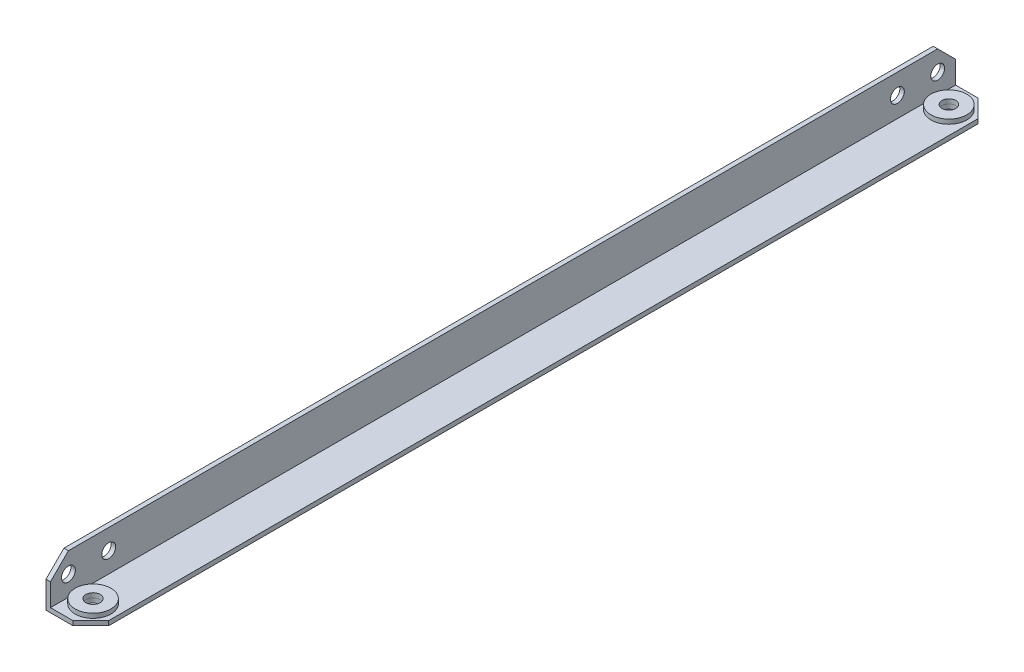
ISO-10303-21;
HEADER;
FILE_DESCRIPTION(('STEP AP214'),'2;1');
FILE_NAME('part.step','',(''),(''),'','','');
FILE_SCHEMA(('AUTOMOTIVE_DESIGN { 1 0 10303 214 1 1 1 1 }'));
ENDSEC;
DATA;
#1=APPLICATION_CONTEXT('core data for automotive mechanical design processes');
#2=APPLICATION_PROTOCOL_DEFINITION('international standard','automotive_design',2000,#1);
#3=PRODUCT_CONTEXT('',#1,'mechanical');
#4=PRODUCT('Part','Part','',(#3));
#5=PRODUCT_RELATED_PRODUCT_CATEGORY('part','',(#4));
#6=PRODUCT_DEFINITION_FORMATION('','',#4);
#7=PRODUCT_DEFINITION_CONTEXT('part definition',#1,'design');
#8=PRODUCT_DEFINITION('design','',#6,#7);
#9=PRODUCT_DEFINITION_SHAPE('','',#8);
#10=(LENGTH_UNIT() NAMED_UNIT(*) SI_UNIT(.MILLI.,.METRE.));
#11=(NAMED_UNIT(*) PLANE_ANGLE_UNIT() SI_UNIT($,.RADIAN.));
#12=(NAMED_UNIT(*) SI_UNIT($,.STERADIAN.) SOLID_ANGLE_UNIT());
#13=UNCERTAINTY_MEASURE_WITH_UNIT(LENGTH_MEASURE(1.E-05),#10,'distance_accuracy_value','');
#14=(GEOMETRIC_REPRESENTATION_CONTEXT(3) GLOBAL_UNCERTAINTY_ASSIGNED_CONTEXT((#13)) GLOBAL_UNIT_ASSIGNED_CONTEXT((#10,
#11,#12)) REPRESENTATION_CONTEXT('',''));
#15=CARTESIAN_POINT('',(0.,0.,0.));
#16=DIRECTION('',(0.,0.,1.));
#17=DIRECTION('',(1.,0.,0.));
#18=AXIS2_PLACEMENT_3D('',#15,#16,#17);
#19=CARTESIAN_POINT('',(50.,20.,55.));
#20=DIRECTION('',(0.,-1.,0.));
#21=DIRECTION('',(1.,0.,0.));
#22=AXIS2_PLACEMENT_3D('',#19,#20,#21);
#23=CYLINDRICAL_SURFACE('',#22,40.);
#24=CARTESIAN_POINT('',(50.,20.,55.));
#25=DIRECTION('',(0.,1.,0.));
#26=DIRECTION('',(-1.,0.,0.));
#27=AXIS2_PLACEMENT_3D('',#24,#25,#26);
#28=CIRCLE('',#27,40.);
#29=CARTESIAN_POINT('',(10.,20.,55.));
#30=VERTEX_POINT('',#29);
#31=EDGE_CURVE('E11',#30,#30,#28,.T.);
#32=ORIENTED_EDGE('',*,*,#31,.F.);
#33=EDGE_LOOP('',(#32));
#34=FACE_BOUND('',#33,.T.);
#35=CARTESIAN_POINT('',(50.,9.99999999999999,55.));
#36=DIRECTION('',(0.,1.,0.));
#37=DIRECTION('',(-1.,0.,0.));
#38=AXIS2_PLACEMENT_3D('',#35,#36,#37);
#39=CIRCLE('',#38,40.);
#40=CARTESIAN_POINT('',(10.,9.99999999999999,55.));
#41=VERTEX_POINT('',#40);
#42=EDGE_CURVE('E46',#41,#41,#39,.T.);
#43=ORIENTED_EDGE('',*,*,#42,.T.);
#44=EDGE_LOOP('',(#43));
#45=FACE_BOUND('',#44,.T.);
#46=ADVANCED_FACE('F39',(#34,#45),#23,.T.);
#47=CARTESIAN_POINT('',(50.,20.,55.));
#48=DIRECTION('',(0.,1.,0.));
#49=DIRECTION('',(-1.,0.,0.));
#50=AXIS2_PLACEMENT_3D('',#47,#48,#49);
#51=PLANE('',#50);
#52=CARTESIAN_POINT('',(50.,20.,55.));
#53=DIRECTION('',(0.,1.,0.));
#54=DIRECTION('',(-1.,0.,0.));
#55=AXIS2_PLACEMENT_3D('',#52,#53,#54);
#56=CIRCLE('',#55,15.5);
#57=CARTESIAN_POINT('',(34.5,20.,55.));
#58=VERTEX_POINT('',#57);
#59=EDGE_CURVE('E52',#58,#58,#56,.T.);
#60=ORIENTED_EDGE('',*,*,#59,.F.);
#61=EDGE_LOOP('',(#60));
#62=FACE_BOUND('',#61,.T.);
#63=ORIENTED_EDGE('',*,*,#31,.T.);
#64=EDGE_LOOP('',(#63));
#65=FACE_BOUND('',#64,.T.);
#66=ADVANCED_FACE('F68',(#62,#65),#51,.T.);
#67=CARTESIAN_POINT('',(50.,9.99999999999999,55.));
#68=DIRECTION('',(0.,1.,0.));
#69=DIRECTION('',(-1.,0.,0.));
#70=AXIS2_PLACEMENT_3D('',#67,#68,#69);
#71=PLANE('',#70);
#72=CARTESIAN_POINT('',(50.,9.99999999999999,55.));
#73=DIRECTION('',(0.,1.,0.));
#74=DIRECTION('',(-1.,0.,0.));
#75=AXIS2_PLACEMENT_3D('',#72,#73,#74);
#76=CIRCLE('',#75,15.5);
#77=CARTESIAN_POINT('',(34.5,9.99999999999999,55.));
#78=VERTEX_POINT('',#77);
#79=EDGE_CURVE('E42',#78,#78,#76,.T.);
#80=ORIENTED_EDGE('',*,*,#79,.T.);
#81=EDGE_LOOP('',(#80));
#82=FACE_BOUND('',#81,.T.);
#83=ORIENTED_EDGE('',*,*,#42,.F.);
#84=EDGE_LOOP('',(#83));
#85=FACE_BOUND('',#84,.T.);
#86=ADVANCED_FACE('F59',(#82,#85),#71,.F.);
#87=CARTESIAN_POINT('',(50.,0.,55.));
#88=DIRECTION('',(0.,1.,0.));
#89=DIRECTION('',(-1.,0.,0.));
#90=AXIS2_PLACEMENT_3D('',#87,#88,#89);
#91=CYLINDRICAL_SURFACE('',#90,15.5);
#92=ORIENTED_EDGE('',*,*,#59,.T.);
#93=EDGE_LOOP('',(#92));
#94=FACE_BOUND('',#93,.T.);
#95=ORIENTED_EDGE('',*,*,#79,.F.);
#96=EDGE_LOOP('',(#95));
#97=FACE_BOUND('',#96,.T.);
#98=ADVANCED_FACE('F62',(#94,#97),#91,.F.);
#99=CLOSED_SHELL('',(#46,#66,#86,#98));
#100=MANIFOLD_SOLID_BREP('B2',#99);
#101=CARTESIAN_POINT('',(50.,20.,1965.));
#102=DIRECTION('',(0.,-1.,0.));
#103=DIRECTION('',(1.,0.,0.));
#104=AXIS2_PLACEMENT_3D('',#101,#102,#103);
#105=CYLINDRICAL_SURFACE('',#104,40.);
#106=CARTESIAN_POINT('',(50.,20.,1965.));
#107=DIRECTION('',(0.,1.,0.));
#108=DIRECTION('',(-1.,0.,0.));
#109=AXIS2_PLACEMENT_3D('',#106,#107,#108);
#110=CIRCLE('',#109,40.);
#111=CARTESIAN_POINT('',(9.99999999999999,20.,1965.));
#112=VERTEX_POINT('',#111);
#113=EDGE_CURVE('E38',#112,#112,#110,.T.);
#114=ORIENTED_EDGE('',*,*,#113,.F.);
#115=EDGE_LOOP('',(#114));
#116=FACE_BOUND('',#115,.T.);
#117=CARTESIAN_POINT('',(50.,9.99999999999999,1965.));
#118=DIRECTION('',(0.,1.,0.));
#119=DIRECTION('',(-1.,0.,0.));
#120=AXIS2_PLACEMENT_3D('',#117,#118,#119);
#121=CIRCLE('',#120,40.);
#122=CARTESIAN_POINT('',(9.99999999999999,9.99999999999999,1965.));
#123=VERTEX_POINT('',#122);
#124=EDGE_CURVE('E116',#123,#123,#121,.T.);
#125=ORIENTED_EDGE('',*,*,#124,.T.);
#126=EDGE_LOOP('',(#125));
#127=FACE_BOUND('',#126,.T.);
#128=ADVANCED_FACE('F109',(#116,#127),#105,.T.);
#129=CARTESIAN_POINT('',(50.,20.,1965.));
#130=DIRECTION('',(0.,1.,0.));
#131=DIRECTION('',(-1.,0.,0.));
#132=AXIS2_PLACEMENT_3D('',#129,#130,#131);
#133=PLANE('',#132);
#134=CARTESIAN_POINT('',(50.,20.,1965.));
#135=DIRECTION('',(0.,1.,0.));
#136=DIRECTION('',(-1.,0.,0.));
#137=AXIS2_PLACEMENT_3D('',#134,#135,#136);
#138=CIRCLE('',#137,16.);
#139=CARTESIAN_POINT('',(34.,20.,1965.));
#140=VERTEX_POINT('',#139);
#141=EDGE_CURVE('E122',#140,#140,#138,.T.);
#142=ORIENTED_EDGE('',*,*,#141,.F.);
#143=EDGE_LOOP('',(#142));
#144=FACE_BOUND('',#143,.T.);
#145=ORIENTED_EDGE('',*,*,#113,.T.);
#146=EDGE_LOOP('',(#145));
#147=FACE_BOUND('',#146,.T.);
#148=ADVANCED_FACE('F138',(#144,#147),#133,.T.);
#149=CARTESIAN_POINT('',(50.,9.99999999999999,1965.));
#150=DIRECTION('',(0.,1.,0.));
#151=DIRECTION('',(-1.,0.,0.));
#152=AXIS2_PLACEMENT_3D('',#149,#150,#151);
#153=PLANE('',#152);
#154=CARTESIAN_POINT('',(50.,9.99999999999999,1965.));
#155=DIRECTION('',(0.,1.,0.));
#156=DIRECTION('',(-1.,0.,0.));
#157=AXIS2_PLACEMENT_3D('',#154,#155,#156);
#158=CIRCLE('',#157,16.);
#159=CARTESIAN_POINT('',(34.,9.99999999999999,1965.));
#160=VERTEX_POINT('',#159);
#161=EDGE_CURVE('E112',#160,#160,#158,.T.);
#162=ORIENTED_EDGE('',*,*,#161,.T.);
#163=EDGE_LOOP('',(#162));
#164=FACE_BOUND('',#163,.T.);
#165=ORIENTED_EDGE('',*,*,#124,.F.);
#166=EDGE_LOOP('',(#165));
#167=FACE_BOUND('',#166,.T.);
#168=ADVANCED_FACE('F129',(#164,#167),#153,.F.);
#169=CARTESIAN_POINT('',(50.,0.,1965.));
#170=DIRECTION('',(0.,1.,0.));
#171=DIRECTION('',(-1.,0.,0.));
#172=AXIS2_PLACEMENT_3D('',#169,#170,#171);
#173=CYLINDRICAL_SURFACE('',#172,16.);
#174=ORIENTED_EDGE('',*,*,#141,.T.);
#175=EDGE_LOOP('',(#174));
#176=FACE_BOUND('',#175,.T.);
#177=ORIENTED_EDGE('',*,*,#161,.F.);
#178=EDGE_LOOP('',(#177));
#179=FACE_BOUND('',#178,.T.);
#180=ADVANCED_FACE('F132',(#176,#179),#173,.F.);
#181=CLOSED_SHELL('',(#128,#148,#168,#180));
#182=MANIFOLD_SOLID_BREP('B6',#181);
#183=CARTESIAN_POINT('',(0.,0.,2020.));
#184=DIRECTION('',(1.,0.,0.));
#185=DIRECTION('',(0.,0.,-1.));
#186=AXIS2_PLACEMENT_3D('',#183,#184,#185);
#187=PLANE('',#186);
#188=CARTESIAN_POINT('',(0.,55.,40.));
#189=DIRECTION('',(1.,0.,0.));
#190=DIRECTION('',(0.,-1.,0.));
#191=AXIS2_PLACEMENT_3D('',#188,#189,#190);
#192=CIRCLE('',#191,15.5);
#193=CARTESIAN_POINT('',(0.,39.5,40.));
#194=VERTEX_POINT('',#193);
#195=EDGE_CURVE('E301',#194,#194,#192,.T.);
#196=ORIENTED_EDGE('',*,*,#195,.T.);
#197=EDGE_LOOP('',(#196));
#198=FACE_BOUND('',#197,.T.);
#199=CARTESIAN_POINT('',(0.,55.,130.));
#200=DIRECTION('',(1.,0.,0.));
#201=DIRECTION('',(0.,-1.,0.));
#202=AXIS2_PLACEMENT_3D('',#199,#200,#201);
#203=CIRCLE('',#202,15.5);
#204=CARTESIAN_POINT('',(0.,39.5,130.));
#205=VERTEX_POINT('',#204);
#206=EDGE_CURVE('E308',#205,#205,#203,.T.);
#207=ORIENTED_EDGE('',*,*,#206,.T.);
#208=EDGE_LOOP('',(#207));
#209=FACE_BOUND('',#208,.T.);
#210=CARTESIAN_POINT('',(0.,55.,1890.));
#211=DIRECTION('',(1.,0.,0.));
#212=DIRECTION('',(0.,1.,0.));
#213=AXIS2_PLACEMENT_3D('',#210,#211,#212);
#214=CIRCLE('',#213,15.5000000000002);
#215=CARTESIAN_POINT('',(0.,70.5000000000001,1890.));
#216=VERTEX_POINT('',#215);
#217=EDGE_CURVE('E314',#216,#216,#214,.T.);
#218=ORIENTED_EDGE('',*,*,#217,.T.);
#219=EDGE_LOOP('',(#218));
#220=FACE_BOUND('',#219,.T.);
#221=CARTESIAN_POINT('',(0.,55.,1980.));
#222=DIRECTION('',(1.,0.,0.));
#223=DIRECTION('',(0.,1.,0.));
#224=AXIS2_PLACEMENT_3D('',#221,#222,#223);
#225=CIRCLE('',#224,15.5000000000002);
#226=CARTESIAN_POINT('',(0.,70.5000000000001,1980.));
#227=VERTEX_POINT('',#226);
#228=EDGE_CURVE('E256',#227,#227,#225,.T.);
#229=ORIENTED_EDGE('',*,*,#228,.T.);
#230=EDGE_LOOP('',(#229));
#231=FACE_BOUND('',#230,.T.);
#232=DIRECTION('',(0.,-0.707106781186547,0.707106781186548));
#233=VECTOR('',#232,1.);
#234=CARTESIAN_POINT('',(0.,30.,2050.));
#235=LINE('',#234,#233);
#236=CARTESIAN_POINT('',(0.,100.,1980.));
#237=VERTEX_POINT('',#236);
#238=CARTESIAN_POINT('',(0.,60.,2020.));
#239=VERTEX_POINT('',#238);
#240=EDGE_CURVE('E184',#237,#239,#235,.T.);
#241=ORIENTED_EDGE('',*,*,#240,.F.);
#242=DIRECTION('',(0.,0.,-1.));
#243=VECTOR('',#242,1.);
#244=CARTESIAN_POINT('',(0.,100.,2020.));
#245=LINE('',#244,#243);
#246=CARTESIAN_POINT('',(0.,100.,40.));
#247=VERTEX_POINT('',#246);
#248=EDGE_CURVE('E342',#237,#247,#245,.T.);
#249=ORIENTED_EDGE('',*,*,#248,.T.);
#250=DIRECTION('',(0.,0.707106781186548,0.707106781186548));
#251=VECTOR('',#250,1.);
#252=CARTESIAN_POINT('',(0.,1040.,980.));
#253=LINE('',#252,#251);
#254=CARTESIAN_POINT('',(0.,60.,0.));
#255=VERTEX_POINT('',#254);
#256=EDGE_CURVE('E273',#255,#247,#253,.T.);
#257=ORIENTED_EDGE('',*,*,#256,.F.);
#258=DIRECTION('',(0.,-1.,0.));
#259=VECTOR('',#258,1.);
#260=CARTESIAN_POINT('',(0.,0.,0.));
#261=LINE('',#260,#259);
#262=CARTESIAN_POINT('',(0.,0.,0.));
#263=VERTEX_POINT('',#262);
#264=EDGE_CURVE('E332',#255,#263,#261,.T.);
#265=ORIENTED_EDGE('',*,*,#264,.T.);
#266=DIRECTION('',(0.,0.,-1.));
#267=VECTOR('',#266,1.);
#268=CARTESIAN_POINT('',(0.,0.,2020.));
#269=LINE('',#268,#267);
#270=CARTESIAN_POINT('',(0.,0.,2020.));
#271=VERTEX_POINT('',#270);
#272=EDGE_CURVE('E350',#271,#263,#269,.T.);
#273=ORIENTED_EDGE('',*,*,#272,.F.);
#274=DIRECTION('',(0.,-1.,0.));
#275=VECTOR('',#274,1.);
#276=CARTESIAN_POINT('',(0.,0.,2020.));
#277=LINE('',#276,#275);
#278=EDGE_CURVE('E336',#239,#271,#277,.T.);
#279=ORIENTED_EDGE('',*,*,#278,.F.);
#280=EDGE_LOOP('',(#241,#249,#257,#265,#273,#279));
#281=FACE_BOUND('',#280,.T.);
#282=ADVANCED_FACE('F170',(#198,#209,#220,#231,#281),#187,.F.);
#283=CARTESIAN_POINT('',(0.,100.,2020.));
#284=DIRECTION('',(0.,-1.,0.));
#285=DIRECTION('',(0.,0.,-1.));
#286=AXIS2_PLACEMENT_3D('',#283,#284,#285);
#287=PLANE('',#286);
#288=DIRECTION('',(-1.,0.,0.));
#289=VECTOR('',#288,1.);
#290=CARTESIAN_POINT('',(2553.68055460293,100.,1980.));
#291=LINE('',#290,#289);
#292=CARTESIAN_POINT('',(9.99999999999999,99.9999999999999,1980.));
#293=VERTEX_POINT('',#292);
#294=EDGE_CURVE('E191',#293,#237,#291,.T.);
#295=ORIENTED_EDGE('',*,*,#294,.F.);
#296=DIRECTION('',(0.,0.,1.));
#297=VECTOR('',#296,1.);
#298=CARTESIAN_POINT('',(9.99999999999999,100.,0.));
#299=LINE('',#298,#297);
#300=CARTESIAN_POINT('',(9.99999999999999,100.,40.));
#301=VERTEX_POINT('',#300);
#302=EDGE_CURVE('E261',#301,#293,#299,.T.);
#303=ORIENTED_EDGE('',*,*,#302,.F.);
#304=DIRECTION('',(-1.,0.,0.));
#305=VECTOR('',#304,1.);
#306=CARTESIAN_POINT('',(2653.68055460293,100.,40.));
#307=LINE('',#306,#305);
#308=EDGE_CURVE('E265',#301,#247,#307,.T.);
#309=ORIENTED_EDGE('',*,*,#308,.T.);
#310=ORIENTED_EDGE('',*,*,#248,.F.);
#311=EDGE_LOOP('',(#295,#303,#309,#310));
#312=FACE_BOUND('',#311,.T.);
#313=ADVANCED_FACE('F367',(#312),#287,.F.);
#314=CARTESIAN_POINT('',(9.99999999999999,100.,0.));
#315=DIRECTION('',(-1.,0.,0.));
#316=DIRECTION('',(0.,-1.,0.));
#317=AXIS2_PLACEMENT_3D('',#314,#315,#316);
#318=PLANE('',#317);
#319=CARTESIAN_POINT('',(10.,55.,40.));
#320=DIRECTION('',(1.,0.,0.));
#321=DIRECTION('',(0.,-1.,0.));
#322=AXIS2_PLACEMENT_3D('',#319,#320,#321);
#323=CIRCLE('',#322,15.5);
#324=CARTESIAN_POINT('',(10.,39.5,40.));
#325=VERTEX_POINT('',#324);
#326=EDGE_CURVE('E305',#325,#325,#323,.T.);
#327=ORIENTED_EDGE('',*,*,#326,.F.);
#328=EDGE_LOOP('',(#327));
#329=FACE_BOUND('',#328,.T.);
#330=CARTESIAN_POINT('',(10.,55.,130.));
#331=DIRECTION('',(1.,0.,0.));
#332=DIRECTION('',(0.,-1.,0.));
#333=AXIS2_PLACEMENT_3D('',#330,#331,#332);
#334=CIRCLE('',#333,15.5);
#335=CARTESIAN_POINT('',(10.,39.5,130.));
#336=VERTEX_POINT('',#335);
#337=EDGE_CURVE('E304',#336,#336,#334,.T.);
#338=ORIENTED_EDGE('',*,*,#337,.F.);
#339=EDGE_LOOP('',(#338));
#340=FACE_BOUND('',#339,.T.);
#341=CARTESIAN_POINT('',(10.,55.,1890.));
#342=DIRECTION('',(1.,0.,0.));
#343=DIRECTION('',(0.,1.,0.));
#344=AXIS2_PLACEMENT_3D('',#341,#342,#343);
#345=CIRCLE('',#344,15.5000000000002);
#346=CARTESIAN_POINT('',(10.,70.5000000000001,1890.));
#347=VERTEX_POINT('',#346);
#348=EDGE_CURVE('E311',#347,#347,#345,.T.);
#349=ORIENTED_EDGE('',*,*,#348,.F.);
#350=EDGE_LOOP('',(#349));
#351=FACE_BOUND('',#350,.T.);
#352=CARTESIAN_POINT('',(10.,55.,1980.));
#353=DIRECTION('',(1.,0.,0.));
#354=DIRECTION('',(0.,1.,0.));
#355=AXIS2_PLACEMENT_3D('',#352,#353,#354);
#356=CIRCLE('',#355,15.5000000000002);
#357=CARTESIAN_POINT('',(10.,70.5000000000001,1980.));
#358=VERTEX_POINT('',#357);
#359=EDGE_CURVE('E317',#358,#358,#356,.T.);
#360=ORIENTED_EDGE('',*,*,#359,.F.);
#361=EDGE_LOOP('',(#360));
#362=FACE_BOUND('',#361,.T.);
#363=DIRECTION('',(0.,0.707106781186547,-0.707106781186548));
#364=VECTOR('',#363,1.);
#365=CARTESIAN_POINT('',(9.99999999999984,1090.,989.999999999999));
#366=LINE('',#365,#364);
#367=CARTESIAN_POINT('',(9.99999999999979,60.,2020.));
#368=VERTEX_POINT('',#367);
#369=EDGE_CURVE('E259',#368,#293,#366,.T.);
#370=ORIENTED_EDGE('',*,*,#369,.F.);
#371=DIRECTION('',(0.,-1.,0.));
#372=VECTOR('',#371,1.);
#373=CARTESIAN_POINT('',(9.99999999999999,100.,2020.));
#374=LINE('',#373,#372);
#375=CARTESIAN_POINT('',(10.,9.99999999999999,2020.));
#376=VERTEX_POINT('',#375);
#377=EDGE_CURVE('E247',#368,#376,#374,.T.);
#378=ORIENTED_EDGE('',*,*,#377,.T.);
#379=DIRECTION('',(0.,0.,1.));
#380=VECTOR('',#379,1.);
#381=CARTESIAN_POINT('',(10.,9.99999999999999,0.));
#382=LINE('',#381,#380);
#383=CARTESIAN_POINT('',(10.,9.99999999999999,0.));
#384=VERTEX_POINT('',#383);
#385=EDGE_CURVE('E333',#384,#376,#382,.T.);
#386=ORIENTED_EDGE('',*,*,#385,.F.);
#387=DIRECTION('',(0.,-1.,0.));
#388=VECTOR('',#387,1.);
#389=CARTESIAN_POINT('',(9.99999999999999,100.,0.));
#390=LINE('',#389,#388);
#391=CARTESIAN_POINT('',(9.99999999999979,60.,0.));
#392=VERTEX_POINT('',#391);
#393=EDGE_CURVE('E324',#392,#384,#390,.T.);
#394=ORIENTED_EDGE('',*,*,#393,.F.);
#395=DIRECTION('',(0.,-0.707106781186548,-0.707106781186548));
#396=VECTOR('',#395,1.);
#397=CARTESIAN_POINT('',(10.,80.,20.));
#398=LINE('',#397,#396);
#399=EDGE_CURVE('E177',#301,#392,#398,.T.);
#400=ORIENTED_EDGE('',*,*,#399,.F.);
#401=ORIENTED_EDGE('',*,*,#302,.T.);
#402=EDGE_LOOP('',(#370,#378,#386,#394,#400,#401));
#403=FACE_BOUND('',#402,.T.);
#404=ADVANCED_FACE('F260',(#329,#340,#351,#362,#403),#318,.F.);
#405=CARTESIAN_POINT('',(0.,100.,2020.));
#406=DIRECTION('',(0.,0.,-1.));
#407=DIRECTION('',(-1.,0.,0.));
#408=AXIS2_PLACEMENT_3D('',#405,#406,#407);
#409=PLANE('',#408);
#410=DIRECTION('',(1.,0.,0.));
#411=VECTOR('',#410,1.);
#412=CARTESIAN_POINT('',(0.,60.,2020.));
#413=LINE('',#412,#411);
#414=EDGE_CURVE('E107',#239,#368,#413,.T.);
#415=ORIENTED_EDGE('',*,*,#414,.F.);
#416=ORIENTED_EDGE('',*,*,#278,.T.);
#417=DIRECTION('',(1.,0.,0.));
#418=VECTOR('',#417,1.);
#419=CARTESIAN_POINT('',(0.,0.,2020.));
#420=LINE('',#419,#418);
#421=CARTESIAN_POINT('',(60.,0.,2020.));
#422=VERTEX_POINT('',#421);
#423=EDGE_CURVE('E338',#271,#422,#420,.T.);
#424=ORIENTED_EDGE('',*,*,#423,.T.);
#425=DIRECTION('',(0.,-1.,0.));
#426=VECTOR('',#425,1.);
#427=CARTESIAN_POINT('',(59.9999999999999,2553.68055460293,2020.));
#428=LINE('',#427,#426);
#429=CARTESIAN_POINT('',(60.,9.99999999999979,2020.));
#430=VERTEX_POINT('',#429);
#431=EDGE_CURVE('E285',#430,#422,#428,.T.);
#432=ORIENTED_EDGE('',*,*,#431,.F.);
#433=DIRECTION('',(1.,0.,0.));
#434=VECTOR('',#433,1.);
#435=CARTESIAN_POINT('',(100.,9.99999999999999,2020.));
#436=LINE('',#435,#434);
#437=EDGE_CURVE('E252',#376,#430,#436,.T.);
#438=ORIENTED_EDGE('',*,*,#437,.F.);
#439=ORIENTED_EDGE('',*,*,#377,.F.);
#440=EDGE_LOOP('',(#415,#416,#424,#432,#438,#439));
#441=FACE_BOUND('',#440,.T.);
#442=ADVANCED_FACE('F249',(#441),#409,.F.);
#443=CARTESIAN_POINT('',(0.,100.,0.));
#444=DIRECTION('',(0.,0.,-1.));
#445=DIRECTION('',(-1.,0.,0.));
#446=AXIS2_PLACEMENT_3D('',#443,#444,#445);
#447=PLANE('',#446);
#448=ORIENTED_EDGE('',*,*,#264,.F.);
#449=DIRECTION('',(-1.,0.,0.));
#450=VECTOR('',#449,1.);
#451=CARTESIAN_POINT('',(2653.68055460293,60.0000000000004,0.));
#452=LINE('',#451,#450);
#453=EDGE_CURVE('E268',#392,#255,#452,.T.);
#454=ORIENTED_EDGE('',*,*,#453,.F.);
#455=ORIENTED_EDGE('',*,*,#393,.T.);
#456=DIRECTION('',(1.,0.,0.));
#457=VECTOR('',#456,1.);
#458=CARTESIAN_POINT('',(100.,9.99999999999999,0.));
#459=LINE('',#458,#457);
#460=CARTESIAN_POINT('',(60.,9.99999999999999,0.));
#461=VERTEX_POINT('',#460);
#462=EDGE_CURVE('E326',#384,#461,#459,.T.);
#463=ORIENTED_EDGE('',*,*,#462,.T.);
#464=DIRECTION('',(0.,-1.,0.));
#465=VECTOR('',#464,1.);
#466=CARTESIAN_POINT('',(59.9999999999999,2553.68055460293,0.));
#467=LINE('',#466,#465);
#468=CARTESIAN_POINT('',(60.,0.,0.));
#469=VERTEX_POINT('',#468);
#470=EDGE_CURVE('E277',#461,#469,#467,.T.);
#471=ORIENTED_EDGE('',*,*,#470,.T.);
#472=DIRECTION('',(1.,0.,0.));
#473=VECTOR('',#472,1.);
#474=CARTESIAN_POINT('',(0.,0.,0.));
#475=LINE('',#474,#473);
#476=EDGE_CURVE('E339',#263,#469,#475,.T.);
#477=ORIENTED_EDGE('',*,*,#476,.F.);
#478=EDGE_LOOP('',(#448,#454,#455,#463,#471,#477));
#479=FACE_BOUND('',#478,.T.);
#480=ADVANCED_FACE('F372',(#479),#447,.T.);
#481=CARTESIAN_POINT('',(0.,0.,2020.));
#482=DIRECTION('',(0.,1.,0.));
#483=DIRECTION('',(0.,0.,1.));
#484=AXIS2_PLACEMENT_3D('',#481,#482,#483);
#485=PLANE('',#484);
#486=CARTESIAN_POINT('',(50.,0.,55.));
#487=DIRECTION('',(0.,1.,0.));
#488=DIRECTION('',(-1.,0.,0.));
#489=AXIS2_PLACEMENT_3D('',#486,#487,#488);
#490=CIRCLE('',#489,15.5);
#491=CARTESIAN_POINT('',(34.5,0.,55.));
#492=VERTEX_POINT('',#491);
#493=EDGE_CURVE('E297',#492,#492,#490,.T.);
#494=ORIENTED_EDGE('',*,*,#493,.T.);
#495=EDGE_LOOP('',(#494));
#496=FACE_BOUND('',#495,.T.);
#497=CARTESIAN_POINT('',(50.,0.,1965.));
#498=DIRECTION('',(0.,1.,0.));
#499=DIRECTION('',(-1.,0.,0.));
#500=AXIS2_PLACEMENT_3D('',#497,#498,#499);
#501=CIRCLE('',#500,16.);
#502=CARTESIAN_POINT('',(34.,0.,1965.));
#503=VERTEX_POINT('',#502);
#504=EDGE_CURVE('E293',#503,#503,#501,.T.);
#505=ORIENTED_EDGE('',*,*,#504,.T.);
#506=EDGE_LOOP('',(#505));
#507=FACE_BOUND('',#506,.T.);
#508=DIRECTION('',(-0.707106781186548,0.,-0.707106781186548));
#509=VECTOR('',#508,1.);
#510=CARTESIAN_POINT('',(1040.,0.,980.));
#511=LINE('',#510,#509);
#512=CARTESIAN_POINT('',(100.,0.,39.9999999999998));
#513=VERTEX_POINT('',#512);
#514=EDGE_CURVE('E281',#513,#469,#511,.T.);
#515=ORIENTED_EDGE('',*,*,#514,.F.);
#516=DIRECTION('',(0.,0.,-1.));
#517=VECTOR('',#516,1.);
#518=CARTESIAN_POINT('',(100.,0.,2020.));
#519=LINE('',#518,#517);
#520=CARTESIAN_POINT('',(100.,0.,1980.));
#521=VERTEX_POINT('',#520);
#522=EDGE_CURVE('E347',#521,#513,#519,.T.);
#523=ORIENTED_EDGE('',*,*,#522,.F.);
#524=DIRECTION('',(-0.707106781186547,0.,0.707106781186548));
#525=VECTOR('',#524,1.);
#526=CARTESIAN_POINT('',(30.,0.,2050.));
#527=LINE('',#526,#525);
#528=EDGE_CURVE('E289',#521,#422,#527,.T.);
#529=ORIENTED_EDGE('',*,*,#528,.T.);
#530=ORIENTED_EDGE('',*,*,#423,.F.);
#531=ORIENTED_EDGE('',*,*,#272,.T.);
#532=ORIENTED_EDGE('',*,*,#476,.T.);
#533=EDGE_LOOP('',(#515,#523,#529,#530,#531,#532));
#534=FACE_BOUND('',#533,.T.);
#535=ADVANCED_FACE('F376',(#496,#507,#534),#485,.F.);
#536=CARTESIAN_POINT('',(100.,0.,2020.));
#537=DIRECTION('',(-1.,0.,0.));
#538=DIRECTION('',(0.,0.,1.));
#539=AXIS2_PLACEMENT_3D('',#536,#537,#538);
#540=PLANE('',#539);
#541=DIRECTION('',(0.,-1.,0.));
#542=VECTOR('',#541,1.);
#543=CARTESIAN_POINT('',(99.9999999999999,2553.68055460293,40.));
#544=LINE('',#543,#542);
#545=CARTESIAN_POINT('',(100.,9.99999999999979,40.));
#546=VERTEX_POINT('',#545);
#547=EDGE_CURVE('E278',#546,#513,#544,.T.);
#548=ORIENTED_EDGE('',*,*,#547,.F.);
#549=DIRECTION('',(0.,0.,1.));
#550=VECTOR('',#549,1.);
#551=CARTESIAN_POINT('',(100.,9.99999999999999,0.));
#552=LINE('',#551,#550);
#553=CARTESIAN_POINT('',(99.9999999999999,9.99999999999999,1980.));
#554=VERTEX_POINT('',#553);
#555=EDGE_CURVE('E330',#546,#554,#552,.T.);
#556=ORIENTED_EDGE('',*,*,#555,.T.);
#557=DIRECTION('',(0.,-1.,0.));
#558=VECTOR('',#557,1.);
#559=CARTESIAN_POINT('',(99.9999999999999,2553.68055460293,1980.));
#560=LINE('',#559,#558);
#561=EDGE_CURVE('E286',#554,#521,#560,.T.);
#562=ORIENTED_EDGE('',*,*,#561,.T.);
#563=ORIENTED_EDGE('',*,*,#522,.T.);
#564=EDGE_LOOP('',(#548,#556,#562,#563));
#565=FACE_BOUND('',#564,.T.);
#566=ADVANCED_FACE('F386',(#565),#540,.F.);
#567=CARTESIAN_POINT('',(100.,9.99999999999999,0.));
#568=DIRECTION('',(0.,-1.,0.));
#569=DIRECTION('',(1.,0.,0.));
#570=AXIS2_PLACEMENT_3D('',#567,#568,#569);
#571=PLANE('',#570);
#572=CARTESIAN_POINT('',(50.,9.99999999999999,55.));
#573=DIRECTION('',(0.,-1.,0.));
#574=DIRECTION('',(1.,0.,0.));
#575=AXIS2_PLACEMENT_3D('',#572,#573,#574);
#576=CIRCLE('',#575,15.5);
#577=CARTESIAN_POINT('',(65.5,9.99999999999999,55.));
#578=VERTEX_POINT('',#577);
#579=EDGE_CURVE('E300',#578,#578,#576,.T.);
#580=ORIENTED_EDGE('',*,*,#579,.T.);
#581=EDGE_LOOP('',(#580));
#582=FACE_BOUND('',#581,.T.);
#583=CARTESIAN_POINT('',(50.,9.99999999999999,1965.));
#584=DIRECTION('',(0.,-1.,0.));
#585=DIRECTION('',(1.,0.,0.));
#586=AXIS2_PLACEMENT_3D('',#583,#584,#585);
#587=CIRCLE('',#586,16.);
#588=CARTESIAN_POINT('',(66.,9.99999999999999,1965.));
#589=VERTEX_POINT('',#588);
#590=EDGE_CURVE('E296',#589,#589,#587,.T.);
#591=ORIENTED_EDGE('',*,*,#590,.T.);
#592=EDGE_LOOP('',(#591));
#593=FACE_BOUND('',#592,.T.);
#594=DIRECTION('',(0.707106781186548,0.,0.707106781186548));
#595=VECTOR('',#594,1.);
#596=CARTESIAN_POINT('',(80.,9.99999999999999,20.));
#597=LINE('',#596,#595);
#598=EDGE_CURVE('E360',#461,#546,#597,.T.);
#599=ORIENTED_EDGE('',*,*,#598,.F.);
#600=ORIENTED_EDGE('',*,*,#462,.F.);
#601=ORIENTED_EDGE('',*,*,#385,.T.);
#602=ORIENTED_EDGE('',*,*,#437,.T.);
#603=DIRECTION('',(0.707106781186547,0.,-0.707106781186548));
#604=VECTOR('',#603,1.);
#605=CARTESIAN_POINT('',(1090.,10.0000000000001,989.999999999999));
#606=LINE('',#605,#604);
#607=EDGE_CURVE('E353',#430,#554,#606,.T.);
#608=ORIENTED_EDGE('',*,*,#607,.T.);
#609=ORIENTED_EDGE('',*,*,#555,.F.);
#610=EDGE_LOOP('',(#599,#600,#601,#602,#608,#609));
#611=FACE_BOUND('',#610,.T.);
#612=ADVANCED_FACE('F379',(#582,#593,#611),#571,.F.);
#613=CARTESIAN_POINT('',(0.,55.,1980.));
#614=DIRECTION('',(1.,0.,0.));
#615=DIRECTION('',(0.,1.,0.));
#616=AXIS2_PLACEMENT_3D('',#613,#614,#615);
#617=CYLINDRICAL_SURFACE('',#616,15.5000000000002);
#618=ORIENTED_EDGE('',*,*,#228,.F.);
#619=EDGE_LOOP('',(#618));
#620=FACE_BOUND('',#619,.T.);
#621=ORIENTED_EDGE('',*,*,#359,.T.);
#622=EDGE_LOOP('',(#621));
#623=FACE_BOUND('',#622,.T.);
#624=ADVANCED_FACE('F414',(#620,#623),#617,.F.);
#625=CARTESIAN_POINT('',(0.,55.,1890.));
#626=DIRECTION('',(1.,0.,0.));
#627=DIRECTION('',(0.,1.,0.));
#628=AXIS2_PLACEMENT_3D('',#625,#626,#627);
#629=CYLINDRICAL_SURFACE('',#628,15.5000000000002);
#630=ORIENTED_EDGE('',*,*,#217,.F.);
#631=EDGE_LOOP('',(#630));
#632=FACE_BOUND('',#631,.T.);
#633=ORIENTED_EDGE('',*,*,#348,.T.);
#634=EDGE_LOOP('',(#633));
#635=FACE_BOUND('',#634,.T.);
#636=ADVANCED_FACE('F417',(#632,#635),#629,.F.);
#637=CARTESIAN_POINT('',(0.,55.,130.));
#638=DIRECTION('',(1.,0.,0.));
#639=DIRECTION('',(0.,1.,0.));
#640=AXIS2_PLACEMENT_3D('',#637,#638,#639);
#641=CYLINDRICAL_SURFACE('',#640,15.5);
#642=ORIENTED_EDGE('',*,*,#206,.F.);
#643=EDGE_LOOP('',(#642));
#644=FACE_BOUND('',#643,.T.);
#645=ORIENTED_EDGE('',*,*,#337,.T.);
#646=EDGE_LOOP('',(#645));
#647=FACE_BOUND('',#646,.T.);
#648=ADVANCED_FACE('F458',(#644,#647),#641,.F.);
#649=CARTESIAN_POINT('',(0.,55.,40.));
#650=DIRECTION('',(1.,0.,0.));
#651=DIRECTION('',(0.,1.,0.));
#652=AXIS2_PLACEMENT_3D('',#649,#650,#651);
#653=CYLINDRICAL_SURFACE('',#652,15.5);
#654=ORIENTED_EDGE('',*,*,#195,.F.);
#655=EDGE_LOOP('',(#654));
#656=FACE_BOUND('',#655,.T.);
#657=ORIENTED_EDGE('',*,*,#326,.T.);
#658=EDGE_LOOP('',(#657));
#659=FACE_BOUND('',#658,.T.);
#660=ADVANCED_FACE('F452',(#656,#659),#653,.F.);
#661=CARTESIAN_POINT('',(50.,0.,55.));
#662=DIRECTION('',(0.,1.,0.));
#663=DIRECTION('',(-1.,0.,0.));
#664=AXIS2_PLACEMENT_3D('',#661,#662,#663);
#665=CYLINDRICAL_SURFACE('',#664,15.5);
#666=ORIENTED_EDGE('',*,*,#493,.F.);
#667=EDGE_LOOP('',(#666));
#668=FACE_BOUND('',#667,.T.);
#669=ORIENTED_EDGE('',*,*,#579,.F.);
#670=EDGE_LOOP('',(#669));
#671=FACE_BOUND('',#670,.T.);
#672=ADVANCED_FACE('F397',(#668,#671),#665,.F.);
#673=CARTESIAN_POINT('',(50.,0.,1965.));
#674=DIRECTION('',(0.,1.,0.));
#675=DIRECTION('',(-1.,0.,0.));
#676=AXIS2_PLACEMENT_3D('',#673,#674,#675);
#677=CYLINDRICAL_SURFACE('',#676,16.);
#678=ORIENTED_EDGE('',*,*,#504,.F.);
#679=EDGE_LOOP('',(#678));
#680=FACE_BOUND('',#679,.T.);
#681=ORIENTED_EDGE('',*,*,#590,.F.);
#682=EDGE_LOOP('',(#681));
#683=FACE_BOUND('',#682,.T.);
#684=ADVANCED_FACE('F390',(#680,#683),#677,.F.);
#685=CARTESIAN_POINT('',(59.9999999999999,2553.68055460293,2020.));
#686=DIRECTION('',(-0.707106781186548,0.,-0.707106781186547));
#687=DIRECTION('',(-0.707106781186547,0.,0.707106781186548));
#688=AXIS2_PLACEMENT_3D('',#685,#686,#687);
#689=PLANE('',#688);
#690=ORIENTED_EDGE('',*,*,#528,.F.);
#691=ORIENTED_EDGE('',*,*,#561,.F.);
#692=ORIENTED_EDGE('',*,*,#607,.F.);
#693=ORIENTED_EDGE('',*,*,#431,.T.);
#694=EDGE_LOOP('',(#690,#691,#692,#693));
#695=FACE_BOUND('',#694,.T.);
#696=ADVANCED_FACE('F388',(#695),#689,.F.);
#697=CARTESIAN_POINT('',(59.9999999999999,2553.68055460293,0.));
#698=DIRECTION('',(0.707106781186547,0.,-0.707106781186547));
#699=DIRECTION('',(-0.707106781186548,0.,-0.707106781186548));
#700=AXIS2_PLACEMENT_3D('',#697,#698,#699);
#701=PLANE('',#700);
#702=ORIENTED_EDGE('',*,*,#547,.T.);
#703=ORIENTED_EDGE('',*,*,#514,.T.);
#704=ORIENTED_EDGE('',*,*,#470,.F.);
#705=ORIENTED_EDGE('',*,*,#598,.T.);
#706=EDGE_LOOP('',(#702,#703,#704,#705));
#707=FACE_BOUND('',#706,.T.);
#708=ADVANCED_FACE('F382',(#707),#701,.T.);
#709=CARTESIAN_POINT('',(2653.68055460293,100.,40.));
#710=DIRECTION('',(0.,0.707106781186548,-0.707106781186548));
#711=DIRECTION('',(0.,0.707106781186548,0.707106781186548));
#712=AXIS2_PLACEMENT_3D('',#709,#710,#711);
#713=PLANE('',#712);
#714=ORIENTED_EDGE('',*,*,#453,.T.);
#715=ORIENTED_EDGE('',*,*,#256,.T.);
#716=ORIENTED_EDGE('',*,*,#308,.F.);
#717=ORIENTED_EDGE('',*,*,#399,.T.);
#718=EDGE_LOOP('',(#714,#715,#716,#717));
#719=FACE_BOUND('',#718,.T.);
#720=ADVANCED_FACE('F365',(#719),#713,.T.);
#721=CARTESIAN_POINT('',(2553.68055460293,60.0000000000004,2020.));
#722=DIRECTION('',(0.,0.707106781186548,0.707106781186547));
#723=DIRECTION('',(0.,-0.707106781186547,0.707106781186548));
#724=AXIS2_PLACEMENT_3D('',#721,#722,#723);
#725=PLANE('',#724);
#726=ORIENTED_EDGE('',*,*,#294,.T.);
#727=ORIENTED_EDGE('',*,*,#240,.T.);
#728=ORIENTED_EDGE('',*,*,#414,.T.);
#729=ORIENTED_EDGE('',*,*,#369,.T.);
#730=EDGE_LOOP('',(#726,#727,#728,#729));
#731=FACE_BOUND('',#730,.T.);
#732=ADVANCED_FACE('F264',(#731),#725,.T.);
#733=CLOSED_SHELL('',(#282,#313,#404,#442,#480,#535,#566,#612,#624,#636,#648,#660,#672,#684,
#696,#708,#720,#732));
#734=MANIFOLD_SOLID_BREP('B33',#733);
#735=ADVANCED_BREP_SHAPE_REPRESENTATION('',(#18,#100,#182,#734),#14);
#736=SHAPE_DEFINITION_REPRESENTATION(#9,#735);
ENDSEC;
END-ISO-10303-21;
